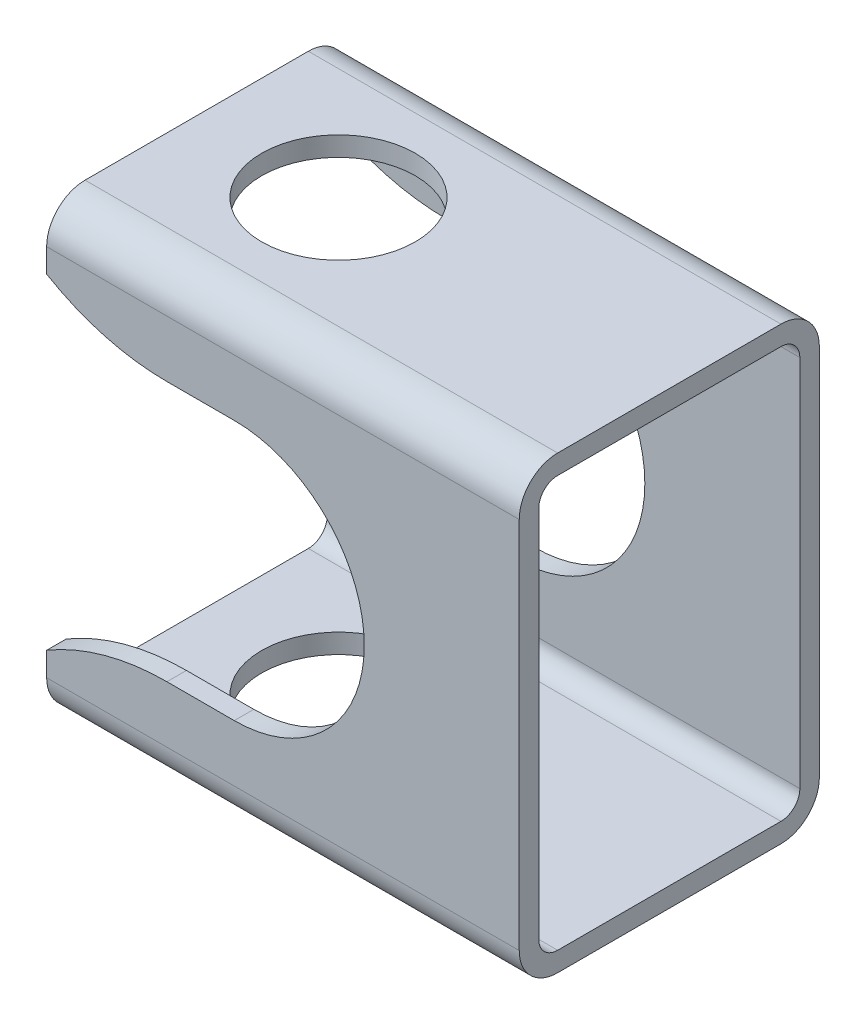
ISO-10303-21;
HEADER;
FILE_DESCRIPTION(('STEP AP214'),'2;1');
FILE_NAME('part.step','',(''),(''),'','','');
FILE_SCHEMA(('AUTOMOTIVE_DESIGN { 1 0 10303 214 1 1 1 1 }'));
ENDSEC;
DATA;
#1=APPLICATION_CONTEXT('core data for automotive mechanical design processes');
#2=APPLICATION_PROTOCOL_DEFINITION('international standard','automotive_design',2000,#1);
#3=PRODUCT_CONTEXT('',#1,'mechanical');
#4=PRODUCT('Part','Part','',(#3));
#5=PRODUCT_RELATED_PRODUCT_CATEGORY('part','',(#4));
#6=PRODUCT_DEFINITION_FORMATION('','',#4);
#7=PRODUCT_DEFINITION_CONTEXT('part definition',#1,'design');
#8=PRODUCT_DEFINITION('design','',#6,#7);
#9=PRODUCT_DEFINITION_SHAPE('','',#8);
#10=(LENGTH_UNIT() NAMED_UNIT(*) SI_UNIT(.MILLI.,.METRE.));
#11=(NAMED_UNIT(*) PLANE_ANGLE_UNIT() SI_UNIT($,.RADIAN.));
#12=(NAMED_UNIT(*) SI_UNIT($,.STERADIAN.) SOLID_ANGLE_UNIT());
#13=UNCERTAINTY_MEASURE_WITH_UNIT(LENGTH_MEASURE(1.E-05),#10,'distance_accuracy_value','');
#14=(GEOMETRIC_REPRESENTATION_CONTEXT(3) GLOBAL_UNCERTAINTY_ASSIGNED_CONTEXT((#13)) GLOBAL_UNIT_ASSIGNED_CONTEXT((#10,
#11,#12)) REPRESENTATION_CONTEXT('',''));
#15=CARTESIAN_POINT('',(0.,0.,0.));
#16=DIRECTION('',(0.,0.,1.));
#17=DIRECTION('',(1.,0.,0.));
#18=AXIS2_PLACEMENT_3D('',#15,#16,#17);
#19=CARTESIAN_POINT('',(0.,-15.7988,9.4488));
#20=DIRECTION('',(1.,0.,0.));
#21=DIRECTION('',(0.,0.,-1.));
#22=AXIS2_PLACEMENT_3D('',#19,#20,#21);
#23=PLANE('',#22);
#24=DIRECTION('',(0.,1.,0.));
#25=VECTOR('',#24,1.);
#26=CARTESIAN_POINT('',(0.,15.7988,-12.7));
#27=LINE('',#26,#25);
#28=CARTESIAN_POINT('',(0.,13.784669622688,-12.7));
#29=VERTEX_POINT('',#28);
#30=CARTESIAN_POINT('',(0.,15.7988,-12.7));
#31=VERTEX_POINT('',#30);
#32=EDGE_CURVE('E264',#29,#31,#27,.T.);
#33=ORIENTED_EDGE('',*,*,#32,.F.);
#34=DIRECTION('',(0.,0.,-1.));
#35=VECTOR('',#34,1.);
#36=CARTESIAN_POINT('',(0.,13.784669622688,12.7));
#37=LINE('',#36,#35);
#38=CARTESIAN_POINT('',(0.,13.784669622688,-11.049));
#39=VERTEX_POINT('',#38);
#40=EDGE_CURVE('E12',#29,#39,#37,.F.);
#41=ORIENTED_EDGE('',*,*,#40,.T.);
#42=DIRECTION('',(0.,1.,0.));
#43=VECTOR('',#42,1.);
#44=CARTESIAN_POINT('',(0.,-15.7988,-11.049));
#45=LINE('',#44,#43);
#46=CARTESIAN_POINT('',(0.,15.7988,-11.049));
#47=VERTEX_POINT('',#46);
#48=EDGE_CURVE('E332',#39,#47,#45,.T.);
#49=ORIENTED_EDGE('',*,*,#48,.T.);
#50=CARTESIAN_POINT('',(0.,15.7988,-9.4488));
#51=DIRECTION('',(1.,0.,0.));
#52=DIRECTION('',(0.,0.,1.));
#53=AXIS2_PLACEMENT_3D('',#50,#51,#52);
#54=CIRCLE('',#53,1.6002);
#55=CARTESIAN_POINT('',(0.,17.399,-9.4488));
#56=VERTEX_POINT('',#55);
#57=EDGE_CURVE('E328',#47,#56,#54,.T.);
#58=ORIENTED_EDGE('',*,*,#57,.T.);
#59=DIRECTION('',(0.,0.,1.));
#60=VECTOR('',#59,1.);
#61=CARTESIAN_POINT('',(0.,17.399,9.4488));
#62=LINE('',#61,#60);
#63=CARTESIAN_POINT('',(0.,17.399,9.4488));
#64=VERTEX_POINT('',#63);
#65=EDGE_CURVE('E254',#56,#64,#62,.T.);
#66=ORIENTED_EDGE('',*,*,#65,.T.);
#67=CARTESIAN_POINT('',(0.,15.7988,9.4488));
#68=DIRECTION('',(1.,0.,0.));
#69=DIRECTION('',(0.,0.,1.));
#70=AXIS2_PLACEMENT_3D('',#67,#68,#69);
#71=CIRCLE('',#70,1.6002);
#72=CARTESIAN_POINT('',(0.,15.7988,11.049));
#73=VERTEX_POINT('',#72);
#74=EDGE_CURVE('E259',#64,#73,#71,.T.);
#75=ORIENTED_EDGE('',*,*,#74,.T.);
#76=DIRECTION('',(0.,-1.,0.));
#77=VECTOR('',#76,1.);
#78=CARTESIAN_POINT('',(0.,-15.7988,11.049));
#79=LINE('',#78,#77);
#80=CARTESIAN_POINT('',(0.,13.784669622688,11.049));
#81=VERTEX_POINT('',#80);
#82=EDGE_CURVE('E389',#73,#81,#79,.T.);
#83=ORIENTED_EDGE('',*,*,#82,.T.);
#84=DIRECTION('',(0.,0.,-1.));
#85=VECTOR('',#84,1.);
#86=CARTESIAN_POINT('',(0.,13.784669622688,12.7));
#87=LINE('',#86,#85);
#88=CARTESIAN_POINT('',(0.,13.784669622688,12.7));
#89=VERTEX_POINT('',#88);
#90=EDGE_CURVE('E438',#89,#81,#87,.T.);
#91=ORIENTED_EDGE('',*,*,#90,.F.);
#92=DIRECTION('',(0.,-1.,0.));
#93=VECTOR('',#92,1.);
#94=CARTESIAN_POINT('',(0.,15.7988,12.7));
#95=LINE('',#94,#93);
#96=CARTESIAN_POINT('',(0.,15.7988,12.7));
#97=VERTEX_POINT('',#96);
#98=EDGE_CURVE('E237',#97,#89,#95,.T.);
#99=ORIENTED_EDGE('',*,*,#98,.F.);
#100=CARTESIAN_POINT('',(0.,15.7988,9.4488));
#101=DIRECTION('',(1.,0.,0.));
#102=DIRECTION('',(0.,0.,1.));
#103=AXIS2_PLACEMENT_3D('',#100,#101,#102);
#104=CIRCLE('',#103,3.2512);
#105=CARTESIAN_POINT('',(0.,19.05,9.4488));
#106=VERTEX_POINT('',#105);
#107=EDGE_CURVE('E238',#106,#97,#104,.T.);
#108=ORIENTED_EDGE('',*,*,#107,.F.);
#109=DIRECTION('',(0.,0.,1.));
#110=VECTOR('',#109,1.);
#111=CARTESIAN_POINT('',(0.,19.05,9.4488));
#112=LINE('',#111,#110);
#113=CARTESIAN_POINT('',(0.,19.05,-9.4488));
#114=VERTEX_POINT('',#113);
#115=EDGE_CURVE('E270',#114,#106,#112,.T.);
#116=ORIENTED_EDGE('',*,*,#115,.F.);
#117=CARTESIAN_POINT('',(0.,15.7988,-9.4488));
#118=DIRECTION('',(1.,0.,0.));
#119=DIRECTION('',(0.,0.,-1.));
#120=AXIS2_PLACEMENT_3D('',#117,#118,#119);
#121=CIRCLE('',#120,3.2512);
#122=EDGE_CURVE('E268',#31,#114,#121,.T.);
#123=ORIENTED_EDGE('',*,*,#122,.F.);
#124=EDGE_LOOP('',(#33,#41,#49,#58,#66,#75,#83,#91,#99,#108,#116,#123));
#125=FACE_BOUND('',#124,.T.);
#126=ADVANCED_FACE('F69',(#125),#23,.F.);
#127=CARTESIAN_POINT('',(40.,-15.7988,9.4488));
#128=DIRECTION('',(-1.,0.,0.));
#129=DIRECTION('',(0.,0.,1.));
#130=AXIS2_PLACEMENT_3D('',#127,#128,#129);
#131=CYLINDRICAL_SURFACE('',#130,3.2512);
#132=CARTESIAN_POINT('',(0.,-15.7988,9.4488));
#133=DIRECTION('',(1.,0.,0.));
#134=DIRECTION('',(0.,0.,-1.));
#135=AXIS2_PLACEMENT_3D('',#132,#133,#134);
#136=CIRCLE('',#135,3.2512);
#137=CARTESIAN_POINT('',(0.,-15.7988,12.7));
#138=VERTEX_POINT('',#137);
#139=CARTESIAN_POINT('',(0.,-19.05,9.4488));
#140=VERTEX_POINT('',#139);
#141=EDGE_CURVE('E244',#138,#140,#136,.T.);
#142=ORIENTED_EDGE('',*,*,#141,.T.);
#143=DIRECTION('',(-1.,0.,0.));
#144=VECTOR('',#143,1.);
#145=CARTESIAN_POINT('',(40.,-19.05,9.4488));
#146=LINE('',#145,#144);
#147=CARTESIAN_POINT('',(40.,-19.05,9.4488));
#148=VERTEX_POINT('',#147);
#149=EDGE_CURVE('E291',#148,#140,#146,.T.);
#150=ORIENTED_EDGE('',*,*,#149,.F.);
#151=CARTESIAN_POINT('',(40.,-15.7988,9.4488));
#152=DIRECTION('',(1.,0.,0.));
#153=DIRECTION('',(0.,0.,-1.));
#154=AXIS2_PLACEMENT_3D('',#151,#152,#153);
#155=CIRCLE('',#154,3.2512);
#156=CARTESIAN_POINT('',(40.,-15.7988,12.7));
#157=VERTEX_POINT('',#156);
#158=EDGE_CURVE('E246',#157,#148,#155,.T.);
#159=ORIENTED_EDGE('',*,*,#158,.F.);
#160=DIRECTION('',(-1.,0.,0.));
#161=VECTOR('',#160,1.);
#162=CARTESIAN_POINT('',(40.,-15.7988,12.7));
#163=LINE('',#162,#161);
#164=EDGE_CURVE('E228',#157,#138,#163,.T.);
#165=ORIENTED_EDGE('',*,*,#164,.T.);
#166=EDGE_LOOP('',(#142,#150,#159,#165));
#167=FACE_BOUND('',#166,.T.);
#168=ADVANCED_FACE('F242',(#167),#131,.T.);
#169=CARTESIAN_POINT('',(40.,-19.05,9.4488));
#170=DIRECTION('',(0.,1.,0.));
#171=DIRECTION('',(0.,0.,1.));
#172=AXIS2_PLACEMENT_3D('',#169,#170,#171);
#173=PLANE('',#172);
#174=CARTESIAN_POINT('',(12.,-19.05,0.));
#175=DIRECTION('',(0.,1.,0.));
#176=DIRECTION('',(0.,0.,1.));
#177=AXIS2_PLACEMENT_3D('',#174,#175,#176);
#178=CIRCLE('',#177,6.5);
#179=CARTESIAN_POINT('',(12.,-19.05,6.5));
#180=VERTEX_POINT('',#179);
#181=EDGE_CURVE('E522',#180,#180,#178,.T.);
#182=ORIENTED_EDGE('',*,*,#181,.T.);
#183=EDGE_LOOP('',(#182));
#184=FACE_BOUND('',#183,.T.);
#185=DIRECTION('',(0.,0.,-1.));
#186=VECTOR('',#185,1.);
#187=CARTESIAN_POINT('',(0.,-19.05,9.4488));
#188=LINE('',#187,#186);
#189=CARTESIAN_POINT('',(0.,-19.05,-9.4488));
#190=VERTEX_POINT('',#189);
#191=EDGE_CURVE('E252',#140,#190,#188,.T.);
#192=ORIENTED_EDGE('',*,*,#191,.T.);
#193=DIRECTION('',(-1.,0.,0.));
#194=VECTOR('',#193,1.);
#195=CARTESIAN_POINT('',(40.,-19.05,-9.4488));
#196=LINE('',#195,#194);
#197=CARTESIAN_POINT('',(40.,-19.05,-9.4488));
#198=VERTEX_POINT('',#197);
#199=EDGE_CURVE('E288',#198,#190,#196,.T.);
#200=ORIENTED_EDGE('',*,*,#199,.F.);
#201=DIRECTION('',(0.,0.,-1.));
#202=VECTOR('',#201,1.);
#203=CARTESIAN_POINT('',(40.,-19.05,9.4488));
#204=LINE('',#203,#202);
#205=EDGE_CURVE('E363',#148,#198,#204,.T.);
#206=ORIENTED_EDGE('',*,*,#205,.F.);
#207=ORIENTED_EDGE('',*,*,#149,.T.);
#208=EDGE_LOOP('',(#192,#200,#206,#207));
#209=FACE_BOUND('',#208,.T.);
#210=ADVANCED_FACE('F582',(#184,#209),#173,.F.);
#211=CARTESIAN_POINT('',(40.,-15.7988,-9.4488));
#212=DIRECTION('',(-1.,0.,0.));
#213=DIRECTION('',(0.,0.,1.));
#214=AXIS2_PLACEMENT_3D('',#211,#212,#213);
#215=CYLINDRICAL_SURFACE('',#214,3.2512);
#216=CARTESIAN_POINT('',(0.,-15.7988,-9.4488));
#217=DIRECTION('',(1.,0.,0.));
#218=DIRECTION('',(0.,0.,-1.));
#219=AXIS2_PLACEMENT_3D('',#216,#217,#218);
#220=CIRCLE('',#219,3.2512);
#221=CARTESIAN_POINT('',(0.,-15.7988,-12.7));
#222=VERTEX_POINT('',#221);
#223=EDGE_CURVE('E256',#190,#222,#220,.T.);
#224=ORIENTED_EDGE('',*,*,#223,.T.);
#225=DIRECTION('',(-1.,0.,0.));
#226=VECTOR('',#225,1.);
#227=CARTESIAN_POINT('',(40.,-15.7988,-12.7));
#228=LINE('',#227,#226);
#229=CARTESIAN_POINT('',(40.,-15.7988,-12.7));
#230=VERTEX_POINT('',#229);
#231=EDGE_CURVE('E285',#230,#222,#228,.T.);
#232=ORIENTED_EDGE('',*,*,#231,.F.);
#233=CARTESIAN_POINT('',(40.,-15.7988,-9.4488));
#234=DIRECTION('',(1.,0.,0.));
#235=DIRECTION('',(0.,0.,-1.));
#236=AXIS2_PLACEMENT_3D('',#233,#234,#235);
#237=CIRCLE('',#236,3.2512);
#238=EDGE_CURVE('E365',#198,#230,#237,.T.);
#239=ORIENTED_EDGE('',*,*,#238,.F.);
#240=ORIENTED_EDGE('',*,*,#199,.T.);
#241=EDGE_LOOP('',(#224,#232,#239,#240));
#242=FACE_BOUND('',#241,.T.);
#243=ADVANCED_FACE('F605',(#242),#215,.T.);
#244=CARTESIAN_POINT('',(40.,15.7988,-12.7));
#245=DIRECTION('',(0.,0.,1.));
#246=DIRECTION('',(1.,0.,0.));
#247=AXIS2_PLACEMENT_3D('',#244,#245,#246);
#248=PLANE('',#247);
#249=DIRECTION('',(1.,0.,0.));
#250=VECTOR('',#249,1.);
#251=CARTESIAN_POINT('',(15.88,11.,-12.7));
#252=LINE('',#251,#250);
#253=CARTESIAN_POINT('',(10.18,11.,-12.7));
#254=VERTEX_POINT('',#253);
#255=CARTESIAN_POINT('',(15.88,11.,-12.7));
#256=VERTEX_POINT('',#255);
#257=EDGE_CURVE('E113',#254,#256,#252,.T.);
#258=ORIENTED_EDGE('',*,*,#257,.F.);
#259=CARTESIAN_POINT('',(10.18,31.,-12.7));
#260=DIRECTION('',(0.,0.,-1.));
#261=DIRECTION('',(-1.,0.,0.));
#262=AXIS2_PLACEMENT_3D('',#259,#260,#261);
#263=CIRCLE('',#262,20.);
#264=EDGE_CURVE('E320',#29,#254,#263,.F.);
#265=ORIENTED_EDGE('',*,*,#264,.F.);
#266=ORIENTED_EDGE('',*,*,#32,.T.);
#267=DIRECTION('',(-1.,0.,0.));
#268=VECTOR('',#267,1.);
#269=CARTESIAN_POINT('',(40.,15.7988,-12.7));
#270=LINE('',#269,#268);
#271=CARTESIAN_POINT('',(40.,15.7988,-12.7));
#272=VERTEX_POINT('',#271);
#273=EDGE_CURVE('E282',#272,#31,#270,.T.);
#274=ORIENTED_EDGE('',*,*,#273,.F.);
#275=DIRECTION('',(0.,1.,0.));
#276=VECTOR('',#275,1.);
#277=CARTESIAN_POINT('',(40.,15.7988,-12.7));
#278=LINE('',#277,#276);
#279=EDGE_CURVE('E367',#230,#272,#278,.T.);
#280=ORIENTED_EDGE('',*,*,#279,.F.);
#281=ORIENTED_EDGE('',*,*,#231,.T.);
#282=CARTESIAN_POINT('',(0.,-13.784669622688,-12.7));
#283=VERTEX_POINT('',#282);
#284=EDGE_CURVE('E265',#222,#283,#27,.T.);
#285=ORIENTED_EDGE('',*,*,#284,.T.);
#286=CARTESIAN_POINT('',(10.18,-31.,-12.7));
#287=DIRECTION('',(0.,0.,-1.));
#288=DIRECTION('',(-1.,0.,0.));
#289=AXIS2_PLACEMENT_3D('',#286,#287,#288);
#290=CIRCLE('',#289,20.);
#291=CARTESIAN_POINT('',(10.18,-11.,-12.7));
#292=VERTEX_POINT('',#291);
#293=EDGE_CURVE('E88',#292,#283,#290,.F.);
#294=ORIENTED_EDGE('',*,*,#293,.F.);
#295=DIRECTION('',(1.,0.,0.));
#296=VECTOR('',#295,1.);
#297=CARTESIAN_POINT('',(15.88,-11.,-12.7));
#298=LINE('',#297,#296);
#299=CARTESIAN_POINT('',(15.88,-11.,-12.7));
#300=VERTEX_POINT('',#299);
#301=EDGE_CURVE('E312',#300,#292,#298,.F.);
#302=ORIENTED_EDGE('',*,*,#301,.F.);
#303=CARTESIAN_POINT('',(15.88,0.,-12.7));
#304=DIRECTION('',(0.,0.,-1.));
#305=DIRECTION('',(-1.,0.,0.));
#306=AXIS2_PLACEMENT_3D('',#303,#304,#305);
#307=CIRCLE('',#306,11.);
#308=EDGE_CURVE('E326',#256,#300,#307,.T.);
#309=ORIENTED_EDGE('',*,*,#308,.F.);
#310=EDGE_LOOP('',(#258,#265,#266,#274,#280,#281,#285,#294,#302,#309));
#311=FACE_BOUND('',#310,.T.);
#312=ADVANCED_FACE('F446',(#311),#248,.F.);
#313=CARTESIAN_POINT('',(40.,15.7988,-9.4488));
#314=DIRECTION('',(-1.,0.,0.));
#315=DIRECTION('',(0.,0.,1.));
#316=AXIS2_PLACEMENT_3D('',#313,#314,#315);
#317=CYLINDRICAL_SURFACE('',#316,3.2512);
#318=ORIENTED_EDGE('',*,*,#122,.T.);
#319=DIRECTION('',(-1.,0.,0.));
#320=VECTOR('',#319,1.);
#321=CARTESIAN_POINT('',(40.,19.05,-9.4488));
#322=LINE('',#321,#320);
#323=CARTESIAN_POINT('',(40.,19.05,-9.4488));
#324=VERTEX_POINT('',#323);
#325=EDGE_CURVE('E279',#324,#114,#322,.T.);
#326=ORIENTED_EDGE('',*,*,#325,.F.);
#327=CARTESIAN_POINT('',(40.,15.7988,-9.4488));
#328=DIRECTION('',(1.,0.,0.));
#329=DIRECTION('',(0.,0.,-1.));
#330=AXIS2_PLACEMENT_3D('',#327,#328,#329);
#331=CIRCLE('',#330,3.2512);
#332=EDGE_CURVE('E369',#272,#324,#331,.T.);
#333=ORIENTED_EDGE('',*,*,#332,.F.);
#334=ORIENTED_EDGE('',*,*,#273,.T.);
#335=EDGE_LOOP('',(#318,#326,#333,#334));
#336=FACE_BOUND('',#335,.T.);
#337=ADVANCED_FACE('F535',(#336),#317,.T.);
#338=CARTESIAN_POINT('',(40.,19.05,9.4488));
#339=DIRECTION('',(0.,-1.,0.));
#340=DIRECTION('',(0.,0.,-1.));
#341=AXIS2_PLACEMENT_3D('',#338,#339,#340);
#342=PLANE('',#341);
#343=CARTESIAN_POINT('',(12.,19.05,0.));
#344=DIRECTION('',(0.,1.,0.));
#345=DIRECTION('',(0.,0.,1.));
#346=AXIS2_PLACEMENT_3D('',#343,#344,#345);
#347=CIRCLE('',#346,6.49999999999999);
#348=CARTESIAN_POINT('',(12.,19.05,6.49999999999999));
#349=VERTEX_POINT('',#348);
#350=EDGE_CURVE('E525',#349,#349,#347,.T.);
#351=ORIENTED_EDGE('',*,*,#350,.F.);
#352=EDGE_LOOP('',(#351));
#353=FACE_BOUND('',#352,.T.);
#354=ORIENTED_EDGE('',*,*,#115,.T.);
#355=DIRECTION('',(-1.,0.,0.));
#356=VECTOR('',#355,1.);
#357=CARTESIAN_POINT('',(40.,19.05,9.4488));
#358=LINE('',#357,#356);
#359=CARTESIAN_POINT('',(40.,19.05,9.4488));
#360=VERTEX_POINT('',#359);
#361=EDGE_CURVE('E276',#360,#106,#358,.T.);
#362=ORIENTED_EDGE('',*,*,#361,.F.);
#363=DIRECTION('',(0.,0.,1.));
#364=VECTOR('',#363,1.);
#365=CARTESIAN_POINT('',(40.,19.05,9.4488));
#366=LINE('',#365,#364);
#367=EDGE_CURVE('E371',#324,#360,#366,.T.);
#368=ORIENTED_EDGE('',*,*,#367,.F.);
#369=ORIENTED_EDGE('',*,*,#325,.T.);
#370=EDGE_LOOP('',(#354,#362,#368,#369));
#371=FACE_BOUND('',#370,.T.);
#372=ADVANCED_FACE('F531',(#353,#371),#342,.F.);
#373=CARTESIAN_POINT('',(40.,15.7988,9.4488));
#374=DIRECTION('',(-1.,0.,0.));
#375=DIRECTION('',(0.,0.,1.));
#376=AXIS2_PLACEMENT_3D('',#373,#374,#375);
#377=CYLINDRICAL_SURFACE('',#376,3.2512);
#378=ORIENTED_EDGE('',*,*,#107,.T.);
#379=DIRECTION('',(-1.,0.,0.));
#380=VECTOR('',#379,1.);
#381=CARTESIAN_POINT('',(40.,15.7988,12.7));
#382=LINE('',#381,#380);
#383=CARTESIAN_POINT('',(40.,15.7988,12.7));
#384=VERTEX_POINT('',#383);
#385=EDGE_CURVE('E247',#384,#97,#382,.T.);
#386=ORIENTED_EDGE('',*,*,#385,.F.);
#387=CARTESIAN_POINT('',(40.,15.7988,9.4488));
#388=DIRECTION('',(1.,0.,0.));
#389=DIRECTION('',(0.,0.,1.));
#390=AXIS2_PLACEMENT_3D('',#387,#388,#389);
#391=CIRCLE('',#390,3.2512);
#392=EDGE_CURVE('E373',#360,#384,#391,.T.);
#393=ORIENTED_EDGE('',*,*,#392,.F.);
#394=ORIENTED_EDGE('',*,*,#361,.T.);
#395=EDGE_LOOP('',(#378,#386,#393,#394));
#396=FACE_BOUND('',#395,.T.);
#397=ADVANCED_FACE('F534',(#396),#377,.T.);
#398=CARTESIAN_POINT('',(40.,15.7988,-9.4488));
#399=DIRECTION('',(-1.,0.,0.));
#400=DIRECTION('',(0.,0.,1.));
#401=AXIS2_PLACEMENT_3D('',#398,#399,#400);
#402=CYLINDRICAL_SURFACE('',#401,1.6002);
#403=ORIENTED_EDGE('',*,*,#57,.F.);
#404=DIRECTION('',(-1.,0.,0.));
#405=VECTOR('',#404,1.);
#406=CARTESIAN_POINT('',(40.,15.7988,-11.049));
#407=LINE('',#406,#405);
#408=CARTESIAN_POINT('',(40.,15.7988,-11.049));
#409=VERTEX_POINT('',#408);
#410=EDGE_CURVE('E248',#409,#47,#407,.T.);
#411=ORIENTED_EDGE('',*,*,#410,.F.);
#412=CARTESIAN_POINT('',(40.,15.7988,-9.4488));
#413=DIRECTION('',(1.,0.,0.));
#414=DIRECTION('',(0.,0.,1.));
#415=AXIS2_PLACEMENT_3D('',#412,#413,#414);
#416=CIRCLE('',#415,1.6002);
#417=CARTESIAN_POINT('',(40.,17.399,-9.4488));
#418=VERTEX_POINT('',#417);
#419=EDGE_CURVE('E272',#409,#418,#416,.T.);
#420=ORIENTED_EDGE('',*,*,#419,.T.);
#421=DIRECTION('',(-1.,0.,0.));
#422=VECTOR('',#421,1.);
#423=CARTESIAN_POINT('',(40.,17.399,-9.4488));
#424=LINE('',#423,#422);
#425=EDGE_CURVE('E293',#418,#56,#424,.T.);
#426=ORIENTED_EDGE('',*,*,#425,.T.);
#427=EDGE_LOOP('',(#403,#411,#420,#426));
#428=FACE_BOUND('',#427,.T.);
#429=ADVANCED_FACE('F71',(#428),#402,.F.);
#430=CARTESIAN_POINT('',(40.,-15.7988,-11.049));
#431=DIRECTION('',(0.,0.,1.));
#432=DIRECTION('',(0.,-1.,0.));
#433=AXIS2_PLACEMENT_3D('',#430,#431,#432);
#434=PLANE('',#433);
#435=CARTESIAN_POINT('',(10.18,31.,-11.049));
#436=DIRECTION('',(0.,0.,1.));
#437=DIRECTION('',(0.,-1.,0.));
#438=AXIS2_PLACEMENT_3D('',#435,#436,#437);
#439=CIRCLE('',#438,20.);
#440=CARTESIAN_POINT('',(10.18,11.,-11.049));
#441=VERTEX_POINT('',#440);
#442=EDGE_CURVE('E323',#441,#39,#439,.F.);
#443=ORIENTED_EDGE('',*,*,#442,.F.);
#444=DIRECTION('',(-1.,0.,0.));
#445=VECTOR('',#444,1.);
#446=CARTESIAN_POINT('',(40.,11.,-11.049));
#447=LINE('',#446,#445);
#448=CARTESIAN_POINT('',(15.88,11.,-11.049));
#449=VERTEX_POINT('',#448);
#450=EDGE_CURVE('E325',#449,#441,#447,.T.);
#451=ORIENTED_EDGE('',*,*,#450,.F.);
#452=CARTESIAN_POINT('',(15.88,0.,-11.049));
#453=DIRECTION('',(0.,0.,1.));
#454=DIRECTION('',(0.,-1.,0.));
#455=AXIS2_PLACEMENT_3D('',#452,#453,#454);
#456=CIRCLE('',#455,11.);
#457=CARTESIAN_POINT('',(15.88,-11.,-11.049));
#458=VERTEX_POINT('',#457);
#459=EDGE_CURVE('E124',#458,#449,#456,.T.);
#460=ORIENTED_EDGE('',*,*,#459,.F.);
#461=DIRECTION('',(1.,0.,0.));
#462=VECTOR('',#461,1.);
#463=CARTESIAN_POINT('',(40.,-11.,-11.049));
#464=LINE('',#463,#462);
#465=CARTESIAN_POINT('',(10.18,-11.,-11.049));
#466=VERTEX_POINT('',#465);
#467=EDGE_CURVE('E316',#466,#458,#464,.T.);
#468=ORIENTED_EDGE('',*,*,#467,.F.);
#469=CARTESIAN_POINT('',(10.18,-31.,-11.049));
#470=DIRECTION('',(0.,0.,1.));
#471=DIRECTION('',(0.,-1.,0.));
#472=AXIS2_PLACEMENT_3D('',#469,#470,#471);
#473=CIRCLE('',#472,20.);
#474=CARTESIAN_POINT('',(0.,-13.784669622688,-11.049));
#475=VERTEX_POINT('',#474);
#476=EDGE_CURVE('E319',#475,#466,#473,.F.);
#477=ORIENTED_EDGE('',*,*,#476,.F.);
#478=CARTESIAN_POINT('',(0.,-15.7988,-11.049));
#479=VERTEX_POINT('',#478);
#480=EDGE_CURVE('E376',#479,#475,#45,.T.);
#481=ORIENTED_EDGE('',*,*,#480,.F.);
#482=DIRECTION('',(-1.,0.,0.));
#483=VECTOR('',#482,1.);
#484=CARTESIAN_POINT('',(40.,-15.7988,-11.049));
#485=LINE('',#484,#483);
#486=CARTESIAN_POINT('',(40.,-15.7988,-11.049));
#487=VERTEX_POINT('',#486);
#488=EDGE_CURVE('E307',#487,#479,#485,.T.);
#489=ORIENTED_EDGE('',*,*,#488,.F.);
#490=DIRECTION('',(0.,1.,0.));
#491=VECTOR('',#490,1.);
#492=CARTESIAN_POINT('',(40.,-15.7988,-11.049));
#493=LINE('',#492,#491);
#494=EDGE_CURVE('E341',#487,#409,#493,.T.);
#495=ORIENTED_EDGE('',*,*,#494,.T.);
#496=ORIENTED_EDGE('',*,*,#410,.T.);
#497=ORIENTED_EDGE('',*,*,#48,.F.);
#498=EDGE_LOOP('',(#443,#451,#460,#468,#477,#481,#489,#495,#496,#497));
#499=FACE_BOUND('',#498,.T.);
#500=ADVANCED_FACE('F441',(#499),#434,.T.);
#501=CARTESIAN_POINT('',(40.,-15.7988,-9.4488));
#502=DIRECTION('',(-1.,0.,0.));
#503=DIRECTION('',(0.,0.,1.));
#504=AXIS2_PLACEMENT_3D('',#501,#502,#503);
#505=CYLINDRICAL_SURFACE('',#504,1.6002);
#506=CARTESIAN_POINT('',(0.,-15.7988,-9.4488));
#507=DIRECTION('',(1.,0.,0.));
#508=DIRECTION('',(0.,0.,1.));
#509=AXIS2_PLACEMENT_3D('',#506,#507,#508);
#510=CIRCLE('',#509,1.6002);
#511=CARTESIAN_POINT('',(0.,-17.399,-9.4488));
#512=VERTEX_POINT('',#511);
#513=EDGE_CURVE('E379',#512,#479,#510,.T.);
#514=ORIENTED_EDGE('',*,*,#513,.F.);
#515=DIRECTION('',(-1.,0.,0.));
#516=VECTOR('',#515,1.);
#517=CARTESIAN_POINT('',(40.,-17.399,-9.4488));
#518=LINE('',#517,#516);
#519=CARTESIAN_POINT('',(40.,-17.399,-9.4488));
#520=VERTEX_POINT('',#519);
#521=EDGE_CURVE('E305',#520,#512,#518,.T.);
#522=ORIENTED_EDGE('',*,*,#521,.F.);
#523=CARTESIAN_POINT('',(40.,-15.7988,-9.4488));
#524=DIRECTION('',(1.,0.,0.));
#525=DIRECTION('',(0.,0.,1.));
#526=AXIS2_PLACEMENT_3D('',#523,#524,#525);
#527=CIRCLE('',#526,1.6002);
#528=EDGE_CURVE('E344',#520,#487,#527,.T.);
#529=ORIENTED_EDGE('',*,*,#528,.T.);
#530=ORIENTED_EDGE('',*,*,#488,.T.);
#531=EDGE_LOOP('',(#514,#522,#529,#530));
#532=FACE_BOUND('',#531,.T.);
#533=ADVANCED_FACE('F495',(#532),#505,.F.);
#534=CARTESIAN_POINT('',(40.,-17.399,9.4488));
#535=DIRECTION('',(0.,1.,0.));
#536=DIRECTION('',(0.,0.,1.));
#537=AXIS2_PLACEMENT_3D('',#534,#535,#536);
#538=PLANE('',#537);
#539=CARTESIAN_POINT('',(12.,-17.399,0.));
#540=DIRECTION('',(0.,1.,0.));
#541=DIRECTION('',(0.,0.,1.));
#542=AXIS2_PLACEMENT_3D('',#539,#540,#541);
#543=CIRCLE('',#542,6.49999999999999);
#544=CARTESIAN_POINT('',(12.,-17.399,6.49999999999999));
#545=VERTEX_POINT('',#544);
#546=EDGE_CURVE('E519',#545,#545,#543,.T.);
#547=ORIENTED_EDGE('',*,*,#546,.F.);
#548=EDGE_LOOP('',(#547));
#549=FACE_BOUND('',#548,.T.);
#550=DIRECTION('',(0.,0.,-1.));
#551=VECTOR('',#550,1.);
#552=CARTESIAN_POINT('',(0.,-17.399,9.4488));
#553=LINE('',#552,#551);
#554=CARTESIAN_POINT('',(0.,-17.399,9.4488));
#555=VERTEX_POINT('',#554);
#556=EDGE_CURVE('E382',#555,#512,#553,.T.);
#557=ORIENTED_EDGE('',*,*,#556,.F.);
#558=DIRECTION('',(-1.,0.,0.));
#559=VECTOR('',#558,1.);
#560=CARTESIAN_POINT('',(40.,-17.399,9.4488));
#561=LINE('',#560,#559);
#562=CARTESIAN_POINT('',(40.,-17.399,9.4488));
#563=VERTEX_POINT('',#562);
#564=EDGE_CURVE('E303',#563,#555,#561,.T.);
#565=ORIENTED_EDGE('',*,*,#564,.F.);
#566=DIRECTION('',(0.,0.,-1.));
#567=VECTOR('',#566,1.);
#568=CARTESIAN_POINT('',(40.,-17.399,9.4488));
#569=LINE('',#568,#567);
#570=EDGE_CURVE('E347',#563,#520,#569,.T.);
#571=ORIENTED_EDGE('',*,*,#570,.T.);
#572=ORIENTED_EDGE('',*,*,#521,.T.);
#573=EDGE_LOOP('',(#557,#565,#571,#572));
#574=FACE_BOUND('',#573,.T.);
#575=ADVANCED_FACE('F491',(#549,#574),#538,.T.);
#576=CARTESIAN_POINT('',(40.,-15.7988,9.4488));
#577=DIRECTION('',(-1.,0.,0.));
#578=DIRECTION('',(0.,0.,1.));
#579=AXIS2_PLACEMENT_3D('',#576,#577,#578);
#580=CYLINDRICAL_SURFACE('',#579,1.6002);
#581=CARTESIAN_POINT('',(0.,-15.7988,9.4488));
#582=DIRECTION('',(1.,0.,0.));
#583=DIRECTION('',(0.,0.,1.));
#584=AXIS2_PLACEMENT_3D('',#581,#582,#583);
#585=CIRCLE('',#584,1.6002);
#586=CARTESIAN_POINT('',(0.,-15.7988,11.049));
#587=VERTEX_POINT('',#586);
#588=EDGE_CURVE('E385',#587,#555,#585,.T.);
#589=ORIENTED_EDGE('',*,*,#588,.F.);
#590=DIRECTION('',(-1.,0.,0.));
#591=VECTOR('',#590,1.);
#592=CARTESIAN_POINT('',(40.,-15.7988,11.049));
#593=LINE('',#592,#591);
#594=CARTESIAN_POINT('',(40.,-15.7988,11.049));
#595=VERTEX_POINT('',#594);
#596=EDGE_CURVE('E300',#595,#587,#593,.T.);
#597=ORIENTED_EDGE('',*,*,#596,.F.);
#598=CARTESIAN_POINT('',(40.,-15.7988,9.4488));
#599=DIRECTION('',(1.,0.,0.));
#600=DIRECTION('',(0.,0.,1.));
#601=AXIS2_PLACEMENT_3D('',#598,#599,#600);
#602=CIRCLE('',#601,1.6002);
#603=EDGE_CURVE('E350',#595,#563,#602,.T.);
#604=ORIENTED_EDGE('',*,*,#603,.T.);
#605=ORIENTED_EDGE('',*,*,#564,.T.);
#606=EDGE_LOOP('',(#589,#597,#604,#605));
#607=FACE_BOUND('',#606,.T.);
#608=ADVANCED_FACE('F487',(#607),#580,.F.);
#609=CARTESIAN_POINT('',(40.,-15.7988,11.049));
#610=DIRECTION('',(0.,0.,-1.));
#611=DIRECTION('',(0.,1.,0.));
#612=AXIS2_PLACEMENT_3D('',#609,#610,#611);
#613=PLANE('',#612);
#614=CARTESIAN_POINT('',(10.18,31.,11.049));
#615=DIRECTION('',(0.,0.,-1.));
#616=DIRECTION('',(0.,1.,0.));
#617=AXIS2_PLACEMENT_3D('',#614,#615,#616);
#618=CIRCLE('',#617,20.);
#619=CARTESIAN_POINT('',(10.18,11.,11.049));
#620=VERTEX_POINT('',#619);
#621=EDGE_CURVE('E318',#81,#620,#618,.F.);
#622=ORIENTED_EDGE('',*,*,#621,.F.);
#623=ORIENTED_EDGE('',*,*,#82,.F.);
#624=DIRECTION('',(-1.,0.,0.));
#625=VECTOR('',#624,1.);
#626=CARTESIAN_POINT('',(40.,15.7988,11.049));
#627=LINE('',#626,#625);
#628=CARTESIAN_POINT('',(40.,15.7988,11.049));
#629=VERTEX_POINT('',#628);
#630=EDGE_CURVE('E298',#629,#73,#627,.T.);
#631=ORIENTED_EDGE('',*,*,#630,.F.);
#632=DIRECTION('',(0.,-1.,0.));
#633=VECTOR('',#632,1.);
#634=CARTESIAN_POINT('',(40.,-15.7988,11.049));
#635=LINE('',#634,#633);
#636=EDGE_CURVE('E353',#629,#595,#635,.T.);
#637=ORIENTED_EDGE('',*,*,#636,.T.);
#638=ORIENTED_EDGE('',*,*,#596,.T.);
#639=CARTESIAN_POINT('',(0.,-13.784669622688,11.049));
#640=VERTEX_POINT('',#639);
#641=EDGE_CURVE('E388',#640,#587,#79,.T.);
#642=ORIENTED_EDGE('',*,*,#641,.F.);
#643=CARTESIAN_POINT('',(10.18,-31.,11.049));
#644=DIRECTION('',(0.,0.,-1.));
#645=DIRECTION('',(0.,1.,0.));
#646=AXIS2_PLACEMENT_3D('',#643,#644,#645);
#647=CIRCLE('',#646,20.);
#648=CARTESIAN_POINT('',(10.18,-11.,11.049));
#649=VERTEX_POINT('',#648);
#650=EDGE_CURVE('E469',#649,#640,#647,.F.);
#651=ORIENTED_EDGE('',*,*,#650,.F.);
#652=DIRECTION('',(-1.,0.,0.));
#653=VECTOR('',#652,1.);
#654=CARTESIAN_POINT('',(40.,-11.,11.049));
#655=LINE('',#654,#653);
#656=CARTESIAN_POINT('',(15.88,-11.,11.049));
#657=VERTEX_POINT('',#656);
#658=EDGE_CURVE('E322',#657,#649,#655,.T.);
#659=ORIENTED_EDGE('',*,*,#658,.F.);
#660=CARTESIAN_POINT('',(15.88,0.,11.049));
#661=DIRECTION('',(0.,0.,-1.));
#662=DIRECTION('',(0.,1.,0.));
#663=AXIS2_PLACEMENT_3D('',#660,#661,#662);
#664=CIRCLE('',#663,11.);
#665=CARTESIAN_POINT('',(15.88,11.,11.049));
#666=VERTEX_POINT('',#665);
#667=EDGE_CURVE('E324',#666,#657,#664,.T.);
#668=ORIENTED_EDGE('',*,*,#667,.F.);
#669=DIRECTION('',(1.,0.,0.));
#670=VECTOR('',#669,1.);
#671=CARTESIAN_POINT('',(40.,11.,11.049));
#672=LINE('',#671,#670);
#673=EDGE_CURVE('E315',#620,#666,#672,.T.);
#674=ORIENTED_EDGE('',*,*,#673,.F.);
#675=EDGE_LOOP('',(#622,#623,#631,#637,#638,#642,#651,#659,#668,#674));
#676=FACE_BOUND('',#675,.T.);
#677=ADVANCED_FACE('F405',(#676),#613,.T.);
#678=CARTESIAN_POINT('',(40.,15.7988,9.4488));
#679=DIRECTION('',(-1.,0.,0.));
#680=DIRECTION('',(0.,0.,1.));
#681=AXIS2_PLACEMENT_3D('',#678,#679,#680);
#682=CYLINDRICAL_SURFACE('',#681,1.6002);
#683=ORIENTED_EDGE('',*,*,#74,.F.);
#684=DIRECTION('',(-1.,0.,0.));
#685=VECTOR('',#684,1.);
#686=CARTESIAN_POINT('',(40.,17.399,9.4488));
#687=LINE('',#686,#685);
#688=CARTESIAN_POINT('',(40.,17.399,9.4488));
#689=VERTEX_POINT('',#688);
#690=EDGE_CURVE('E295',#689,#64,#687,.T.);
#691=ORIENTED_EDGE('',*,*,#690,.F.);
#692=CARTESIAN_POINT('',(40.,15.7988,9.4488));
#693=DIRECTION('',(1.,0.,0.));
#694=DIRECTION('',(0.,0.,1.));
#695=AXIS2_PLACEMENT_3D('',#692,#693,#694);
#696=CIRCLE('',#695,1.6002);
#697=EDGE_CURVE('E356',#689,#629,#696,.T.);
#698=ORIENTED_EDGE('',*,*,#697,.T.);
#699=ORIENTED_EDGE('',*,*,#630,.T.);
#700=EDGE_LOOP('',(#683,#691,#698,#699));
#701=FACE_BOUND('',#700,.T.);
#702=ADVANCED_FACE('F400',(#701),#682,.F.);
#703=CARTESIAN_POINT('',(40.,17.399,9.4488));
#704=DIRECTION('',(0.,-1.,0.));
#705=DIRECTION('',(0.,0.,-1.));
#706=AXIS2_PLACEMENT_3D('',#703,#704,#705);
#707=PLANE('',#706);
#708=CARTESIAN_POINT('',(12.,17.399,0.));
#709=DIRECTION('',(0.,-1.,0.));
#710=DIRECTION('',(0.,0.,-1.));
#711=AXIS2_PLACEMENT_3D('',#708,#709,#710);
#712=CIRCLE('',#711,6.49999999999999);
#713=CARTESIAN_POINT('',(12.,17.399,-6.49999999999999));
#714=VERTEX_POINT('',#713);
#715=EDGE_CURVE('E73',#714,#714,#712,.T.);
#716=ORIENTED_EDGE('',*,*,#715,.F.);
#717=EDGE_LOOP('',(#716));
#718=FACE_BOUND('',#717,.T.);
#719=ORIENTED_EDGE('',*,*,#65,.F.);
#720=ORIENTED_EDGE('',*,*,#425,.F.);
#721=DIRECTION('',(0.,0.,1.));
#722=VECTOR('',#721,1.);
#723=CARTESIAN_POINT('',(40.,17.399,9.4488));
#724=LINE('',#723,#722);
#725=EDGE_CURVE('E359',#418,#689,#724,.T.);
#726=ORIENTED_EDGE('',*,*,#725,.T.);
#727=ORIENTED_EDGE('',*,*,#690,.T.);
#728=EDGE_LOOP('',(#719,#720,#726,#727));
#729=FACE_BOUND('',#728,.T.);
#730=ADVANCED_FACE('F596',(#718,#729),#707,.T.);
#731=CARTESIAN_POINT('',(40.,15.7988,12.7));
#732=DIRECTION('',(0.,0.,-1.));
#733=DIRECTION('',(-1.,0.,0.));
#734=AXIS2_PLACEMENT_3D('',#731,#732,#733);
#735=PLANE('',#734);
#736=ORIENTED_EDGE('',*,*,#98,.T.);
#737=CARTESIAN_POINT('',(10.18,31.,12.7));
#738=DIRECTION('',(0.,0.,1.));
#739=DIRECTION('',(-1.,0.,0.));
#740=AXIS2_PLACEMENT_3D('',#737,#738,#739);
#741=CIRCLE('',#740,20.);
#742=CARTESIAN_POINT('',(10.18,11.,12.7));
#743=VERTEX_POINT('',#742);
#744=EDGE_CURVE('E507',#89,#743,#741,.T.);
#745=ORIENTED_EDGE('',*,*,#744,.T.);
#746=DIRECTION('',(1.,0.,0.));
#747=VECTOR('',#746,1.);
#748=CARTESIAN_POINT('',(15.88,11.,12.7));
#749=LINE('',#748,#747);
#750=CARTESIAN_POINT('',(15.88,11.,12.7));
#751=VERTEX_POINT('',#750);
#752=EDGE_CURVE('E505',#743,#751,#749,.T.);
#753=ORIENTED_EDGE('',*,*,#752,.T.);
#754=CARTESIAN_POINT('',(15.88,0.,12.7));
#755=DIRECTION('',(0.,0.,-1.));
#756=DIRECTION('',(-1.,0.,0.));
#757=AXIS2_PLACEMENT_3D('',#754,#755,#756);
#758=CIRCLE('',#757,11.);
#759=CARTESIAN_POINT('',(15.88,-11.,12.7));
#760=VERTEX_POINT('',#759);
#761=EDGE_CURVE('E517',#751,#760,#758,.T.);
#762=ORIENTED_EDGE('',*,*,#761,.T.);
#763=DIRECTION('',(-1.,0.,0.));
#764=VECTOR('',#763,1.);
#765=CARTESIAN_POINT('',(15.88,-11.,12.7));
#766=LINE('',#765,#764);
#767=CARTESIAN_POINT('',(10.18,-11.,12.7));
#768=VERTEX_POINT('',#767);
#769=EDGE_CURVE('E515',#760,#768,#766,.T.);
#770=ORIENTED_EDGE('',*,*,#769,.T.);
#771=CARTESIAN_POINT('',(10.18,-31.,12.7));
#772=DIRECTION('',(0.,0.,1.));
#773=DIRECTION('',(1.,0.,0.));
#774=AXIS2_PLACEMENT_3D('',#771,#772,#773);
#775=CIRCLE('',#774,20.);
#776=CARTESIAN_POINT('',(0.,-13.784669622688,12.7));
#777=VERTEX_POINT('',#776);
#778=EDGE_CURVE('E233',#768,#777,#775,.T.);
#779=ORIENTED_EDGE('',*,*,#778,.T.);
#780=EDGE_CURVE('E223',#777,#138,#95,.T.);
#781=ORIENTED_EDGE('',*,*,#780,.T.);
#782=ORIENTED_EDGE('',*,*,#164,.F.);
#783=DIRECTION('',(0.,-1.,0.));
#784=VECTOR('',#783,1.);
#785=CARTESIAN_POINT('',(40.,15.7988,12.7));
#786=LINE('',#785,#784);
#787=EDGE_CURVE('E296',#384,#157,#786,.T.);
#788=ORIENTED_EDGE('',*,*,#787,.F.);
#789=ORIENTED_EDGE('',*,*,#385,.T.);
#790=EDGE_LOOP('',(#736,#745,#753,#762,#770,#779,#781,#782,#788,#789));
#791=FACE_BOUND('',#790,.T.);
#792=ADVANCED_FACE('F226',(#791),#735,.F.);
#793=CARTESIAN_POINT('',(40.,-15.7988,9.4488));
#794=DIRECTION('',(1.,0.,0.));
#795=DIRECTION('',(0.,0.,-1.));
#796=AXIS2_PLACEMENT_3D('',#793,#794,#795);
#797=PLANE('',#796);
#798=ORIENTED_EDGE('',*,*,#419,.F.);
#799=ORIENTED_EDGE('',*,*,#494,.F.);
#800=ORIENTED_EDGE('',*,*,#528,.F.);
#801=ORIENTED_EDGE('',*,*,#570,.F.);
#802=ORIENTED_EDGE('',*,*,#603,.F.);
#803=ORIENTED_EDGE('',*,*,#636,.F.);
#804=ORIENTED_EDGE('',*,*,#697,.F.);
#805=ORIENTED_EDGE('',*,*,#725,.F.);
#806=EDGE_LOOP('',(#798,#799,#800,#801,#802,#803,#804,#805));
#807=FACE_BOUND('',#806,.T.);
#808=ORIENTED_EDGE('',*,*,#158,.T.);
#809=ORIENTED_EDGE('',*,*,#205,.T.);
#810=ORIENTED_EDGE('',*,*,#238,.T.);
#811=ORIENTED_EDGE('',*,*,#279,.T.);
#812=ORIENTED_EDGE('',*,*,#332,.T.);
#813=ORIENTED_EDGE('',*,*,#367,.T.);
#814=ORIENTED_EDGE('',*,*,#392,.T.);
#815=ORIENTED_EDGE('',*,*,#787,.T.);
#816=EDGE_LOOP('',(#808,#809,#810,#811,#812,#813,#814,#815));
#817=FACE_BOUND('',#816,.T.);
#818=ADVANCED_FACE('F586',(#807,#817),#797,.T.);
#819=ORIENTED_EDGE('',*,*,#780,.F.);
#820=DIRECTION('',(0.,0.,-1.));
#821=VECTOR('',#820,1.);
#822=CARTESIAN_POINT('',(0.,-13.784669622688,12.7));
#823=LINE('',#822,#821);
#824=EDGE_CURVE('E464',#777,#640,#823,.T.);
#825=ORIENTED_EDGE('',*,*,#824,.T.);
#826=ORIENTED_EDGE('',*,*,#641,.T.);
#827=ORIENTED_EDGE('',*,*,#588,.T.);
#828=ORIENTED_EDGE('',*,*,#556,.T.);
#829=ORIENTED_EDGE('',*,*,#513,.T.);
#830=ORIENTED_EDGE('',*,*,#480,.T.);
#831=DIRECTION('',(0.,0.,-1.));
#832=VECTOR('',#831,1.);
#833=CARTESIAN_POINT('',(0.,-13.784669622688,12.7));
#834=LINE('',#833,#832);
#835=EDGE_CURVE('E79',#475,#283,#834,.T.);
#836=ORIENTED_EDGE('',*,*,#835,.T.);
#837=ORIENTED_EDGE('',*,*,#284,.F.);
#838=ORIENTED_EDGE('',*,*,#223,.F.);
#839=ORIENTED_EDGE('',*,*,#191,.F.);
#840=ORIENTED_EDGE('',*,*,#141,.F.);
#841=EDGE_LOOP('',(#819,#825,#826,#827,#828,#829,#830,#836,#837,#838,#839,#840));
#842=FACE_BOUND('',#841,.T.);
#843=ADVANCED_FACE('F250',(#842),#23,.F.);
#844=CARTESIAN_POINT('',(10.18,31.,12.7));
#845=DIRECTION('',(0.,0.,-1.));
#846=DIRECTION('',(-1.,0.,0.));
#847=AXIS2_PLACEMENT_3D('',#844,#845,#846);
#848=CYLINDRICAL_SURFACE('',#847,20.);
#849=DIRECTION('',(0.,0.,-1.));
#850=VECTOR('',#849,1.);
#851=CARTESIAN_POINT('',(10.18,11.,12.7));
#852=LINE('',#851,#850);
#853=EDGE_CURVE('E429',#441,#254,#852,.T.);
#854=ORIENTED_EDGE('',*,*,#853,.F.);
#855=ORIENTED_EDGE('',*,*,#442,.T.);
#856=ORIENTED_EDGE('',*,*,#40,.F.);
#857=ORIENTED_EDGE('',*,*,#264,.T.);
#858=EDGE_LOOP('',(#854,#855,#856,#857));
#859=FACE_BOUND('',#858,.T.);
#860=ADVANCED_FACE('F435',(#859),#848,.T.);
#861=CARTESIAN_POINT('',(15.88,11.,12.7));
#862=DIRECTION('',(0.,1.,0.));
#863=DIRECTION('',(0.,0.,1.));
#864=AXIS2_PLACEMENT_3D('',#861,#862,#863);
#865=PLANE('',#864);
#866=DIRECTION('',(0.,0.,-1.));
#867=VECTOR('',#866,1.);
#868=CARTESIAN_POINT('',(15.88,11.,12.7));
#869=LINE('',#868,#867);
#870=EDGE_CURVE('E430',#449,#256,#869,.T.);
#871=ORIENTED_EDGE('',*,*,#870,.F.);
#872=ORIENTED_EDGE('',*,*,#450,.T.);
#873=ORIENTED_EDGE('',*,*,#853,.T.);
#874=ORIENTED_EDGE('',*,*,#257,.T.);
#875=EDGE_LOOP('',(#871,#872,#873,#874));
#876=FACE_BOUND('',#875,.T.);
#877=ADVANCED_FACE('F428',(#876),#865,.F.);
#878=CARTESIAN_POINT('',(10.18,-31.,12.7));
#879=DIRECTION('',(0.,0.,-1.));
#880=DIRECTION('',(-1.,0.,0.));
#881=AXIS2_PLACEMENT_3D('',#878,#879,#880);
#882=CYLINDRICAL_SURFACE('',#881,20.);
#883=ORIENTED_EDGE('',*,*,#835,.F.);
#884=ORIENTED_EDGE('',*,*,#476,.T.);
#885=DIRECTION('',(0.,0.,-1.));
#886=VECTOR('',#885,1.);
#887=CARTESIAN_POINT('',(10.18,-11.,12.7));
#888=LINE('',#887,#886);
#889=EDGE_CURVE('E454',#466,#292,#888,.T.);
#890=ORIENTED_EDGE('',*,*,#889,.T.);
#891=ORIENTED_EDGE('',*,*,#293,.T.);
#892=EDGE_LOOP('',(#883,#884,#890,#891));
#893=FACE_BOUND('',#892,.T.);
#894=ADVANCED_FACE('F458',(#893),#882,.T.);
#895=CARTESIAN_POINT('',(15.88,-11.,12.7));
#896=DIRECTION('',(0.,-1.,0.));
#897=DIRECTION('',(0.,0.,-1.));
#898=AXIS2_PLACEMENT_3D('',#895,#896,#897);
#899=PLANE('',#898);
#900=ORIENTED_EDGE('',*,*,#889,.F.);
#901=ORIENTED_EDGE('',*,*,#467,.T.);
#902=DIRECTION('',(0.,0.,-1.));
#903=VECTOR('',#902,1.);
#904=CARTESIAN_POINT('',(15.88,-11.,12.7));
#905=LINE('',#904,#903);
#906=EDGE_CURVE('E456',#458,#300,#905,.T.);
#907=ORIENTED_EDGE('',*,*,#906,.T.);
#908=ORIENTED_EDGE('',*,*,#301,.T.);
#909=EDGE_LOOP('',(#900,#901,#907,#908));
#910=FACE_BOUND('',#909,.T.);
#911=ADVANCED_FACE('F452',(#910),#899,.F.);
#912=CARTESIAN_POINT('',(15.88,0.,12.7));
#913=DIRECTION('',(0.,0.,-1.));
#914=DIRECTION('',(-1.,0.,0.));
#915=AXIS2_PLACEMENT_3D('',#912,#913,#914);
#916=CYLINDRICAL_SURFACE('',#915,11.);
#917=ORIENTED_EDGE('',*,*,#906,.F.);
#918=ORIENTED_EDGE('',*,*,#459,.T.);
#919=ORIENTED_EDGE('',*,*,#870,.T.);
#920=ORIENTED_EDGE('',*,*,#308,.T.);
#921=EDGE_LOOP('',(#917,#918,#919,#920));
#922=FACE_BOUND('',#921,.T.);
#923=ADVANCED_FACE('F504',(#922),#916,.F.);
#924=ORIENTED_EDGE('',*,*,#667,.T.);
#925=EDGE_CURVE('E461',#760,#657,#905,.T.);
#926=ORIENTED_EDGE('',*,*,#925,.F.);
#927=ORIENTED_EDGE('',*,*,#761,.F.);
#928=EDGE_CURVE('E470',#751,#666,#869,.T.);
#929=ORIENTED_EDGE('',*,*,#928,.T.);
#930=EDGE_LOOP('',(#924,#926,#927,#929));
#931=FACE_BOUND('',#930,.T.);
#932=ADVANCED_FACE('F562',(#931),#916,.F.);
#933=ORIENTED_EDGE('',*,*,#673,.T.);
#934=ORIENTED_EDGE('',*,*,#928,.F.);
#935=ORIENTED_EDGE('',*,*,#752,.F.);
#936=EDGE_CURVE('E437',#743,#620,#852,.T.);
#937=ORIENTED_EDGE('',*,*,#936,.T.);
#938=EDGE_LOOP('',(#933,#934,#935,#937));
#939=FACE_BOUND('',#938,.T.);
#940=ADVANCED_FACE('F564',(#939),#865,.F.);
#941=ORIENTED_EDGE('',*,*,#621,.T.);
#942=ORIENTED_EDGE('',*,*,#936,.F.);
#943=ORIENTED_EDGE('',*,*,#744,.F.);
#944=ORIENTED_EDGE('',*,*,#90,.T.);
#945=EDGE_LOOP('',(#941,#942,#943,#944));
#946=FACE_BOUND('',#945,.T.);
#947=ADVANCED_FACE('F570',(#946),#848,.T.);
#948=ORIENTED_EDGE('',*,*,#650,.T.);
#949=ORIENTED_EDGE('',*,*,#824,.F.);
#950=ORIENTED_EDGE('',*,*,#778,.F.);
#951=EDGE_CURVE('E460',#768,#649,#888,.T.);
#952=ORIENTED_EDGE('',*,*,#951,.T.);
#953=EDGE_LOOP('',(#948,#949,#950,#952));
#954=FACE_BOUND('',#953,.T.);
#955=ADVANCED_FACE('F559',(#954),#882,.T.);
#956=ORIENTED_EDGE('',*,*,#658,.T.);
#957=ORIENTED_EDGE('',*,*,#951,.F.);
#958=ORIENTED_EDGE('',*,*,#769,.F.);
#959=ORIENTED_EDGE('',*,*,#925,.T.);
#960=EDGE_LOOP('',(#956,#957,#958,#959));
#961=FACE_BOUND('',#960,.T.);
#962=ADVANCED_FACE('F556',(#961),#899,.F.);
#963=CARTESIAN_POINT('',(12.,19.05,0.));
#964=DIRECTION('',(0.,1.,0.));
#965=DIRECTION('',(0.,0.,1.));
#966=AXIS2_PLACEMENT_3D('',#963,#964,#965);
#967=CYLINDRICAL_SURFACE('',#966,6.49999999999999);
#968=ORIENTED_EDGE('',*,*,#715,.T.);
#969=EDGE_LOOP('',(#968));
#970=FACE_BOUND('',#969,.T.);
#971=ORIENTED_EDGE('',*,*,#350,.T.);
#972=EDGE_LOOP('',(#971));
#973=FACE_BOUND('',#972,.T.);
#974=ADVANCED_FACE('F529',(#970,#973),#967,.F.);
#975=ORIENTED_EDGE('',*,*,#546,.T.);
#976=EDGE_LOOP('',(#975));
#977=FACE_BOUND('',#976,.T.);
#978=ORIENTED_EDGE('',*,*,#181,.F.);
#979=EDGE_LOOP('',(#978));
#980=FACE_BOUND('',#979,.T.);
#981=ADVANCED_FACE('F798',(#977,#980),#967,.F.);
#982=CLOSED_SHELL('',(#126,#168,#210,#243,#312,#337,#372,#397,#429,#500,#533,#575,#608,#677,
#702,#730,#792,#818,#843,#860,#877,#894,#911,#923,#932,#940,#947,#955,#962,#974,#981));
#983=MANIFOLD_SOLID_BREP('B2',#982);
#984=ADVANCED_BREP_SHAPE_REPRESENTATION('',(#18,#983),#14);
#985=SHAPE_DEFINITION_REPRESENTATION(#9,#984);
ENDSEC;
END-ISO-10303-21;
